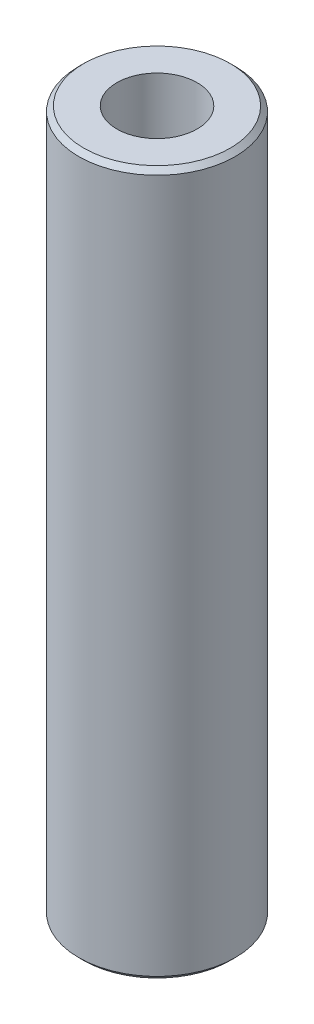
ISO-10303-21;
HEADER;
FILE_DESCRIPTION(('STEP AP214'),'2;1');
FILE_NAME('part.step','',(''),(''),'','','');
FILE_SCHEMA(('AUTOMOTIVE_DESIGN { 1 0 10303 214 1 1 1 1 }'));
ENDSEC;
DATA;
#1=APPLICATION_CONTEXT('core data for automotive mechanical design processes');
#2=APPLICATION_PROTOCOL_DEFINITION('international standard','automotive_design',2000,#1);
#3=PRODUCT_CONTEXT('',#1,'mechanical');
#4=PRODUCT('Part','Part','',(#3));
#5=PRODUCT_RELATED_PRODUCT_CATEGORY('part','',(#4));
#6=PRODUCT_DEFINITION_FORMATION('','',#4);
#7=PRODUCT_DEFINITION_CONTEXT('part definition',#1,'design');
#8=PRODUCT_DEFINITION('design','',#6,#7);
#9=PRODUCT_DEFINITION_SHAPE('','',#8);
#10=(LENGTH_UNIT() NAMED_UNIT(*) SI_UNIT(.MILLI.,.METRE.));
#11=(NAMED_UNIT(*) PLANE_ANGLE_UNIT() SI_UNIT($,.RADIAN.));
#12=(NAMED_UNIT(*) SI_UNIT($,.STERADIAN.) SOLID_ANGLE_UNIT());
#13=UNCERTAINTY_MEASURE_WITH_UNIT(LENGTH_MEASURE(1.E-05),#10,'distance_accuracy_value','');
#14=(GEOMETRIC_REPRESENTATION_CONTEXT(3) GLOBAL_UNCERTAINTY_ASSIGNED_CONTEXT((#13)) GLOBAL_UNIT_ASSIGNED_CONTEXT((#10,
#11,#12)) REPRESENTATION_CONTEXT('',''));
#15=CARTESIAN_POINT('',(0.,0.,0.));
#16=DIRECTION('',(0.,0.,1.));
#17=DIRECTION('',(1.,0.,0.));
#18=AXIS2_PLACEMENT_3D('',#15,#16,#17);
#19=CARTESIAN_POINT('',(0.,28.575,0.));
#20=DIRECTION('',(0.,-1.,0.));
#21=DIRECTION('',(0.,0.,-1.));
#22=AXIS2_PLACEMENT_3D('',#19,#20,#21);
#23=CYLINDRICAL_SURFACE('',#22,6.35);
#24=CARTESIAN_POINT('',(0.,-28.178125,0.));
#25=DIRECTION('',(0.,1.,0.));
#26=DIRECTION('',(0.,0.,1.));
#27=AXIS2_PLACEMENT_3D('',#24,#25,#26);
#28=CIRCLE('',#27,6.35);
#29=CARTESIAN_POINT('',(0.,-28.178125,6.35));
#30=VERTEX_POINT('',#29);
#31=EDGE_CURVE('E49',#30,#30,#28,.T.);
#32=ORIENTED_EDGE('',*,*,#31,.T.);
#33=EDGE_LOOP('',(#32));
#34=FACE_BOUND('',#33,.T.);
#35=CARTESIAN_POINT('',(0.,28.178125,0.));
#36=DIRECTION('',(0.,1.,0.));
#37=DIRECTION('',(0.,0.,1.));
#38=AXIS2_PLACEMENT_3D('',#35,#36,#37);
#39=CIRCLE('',#38,6.35);
#40=CARTESIAN_POINT('',(0.,28.178125,6.35));
#41=VERTEX_POINT('',#40);
#42=EDGE_CURVE('E53',#41,#41,#39,.F.);
#43=ORIENTED_EDGE('',*,*,#42,.T.);
#44=EDGE_LOOP('',(#43));
#45=FACE_BOUND('',#44,.T.);
#46=ADVANCED_FACE('F37',(#34,#45),#23,.T.);
#47=CARTESIAN_POINT('',(0.,28.575,0.));
#48=DIRECTION('',(0.,1.,0.));
#49=DIRECTION('',(0.,0.,1.));
#50=AXIS2_PLACEMENT_3D('',#47,#48,#49);
#51=PLANE('',#50);
#52=CARTESIAN_POINT('',(0.,28.575,0.));
#53=DIRECTION('',(0.,1.,0.));
#54=DIRECTION('',(0.,0.,1.));
#55=AXIS2_PLACEMENT_3D('',#52,#53,#54);
#56=CIRCLE('',#55,3.2639);
#57=CARTESIAN_POINT('',(0.,28.575,3.2639));
#58=VERTEX_POINT('',#57);
#59=EDGE_CURVE('E61',#58,#58,#56,.T.);
#60=ORIENTED_EDGE('',*,*,#59,.F.);
#61=EDGE_LOOP('',(#60));
#62=FACE_BOUND('',#61,.T.);
#63=CARTESIAN_POINT('',(0.,28.575,0.));
#64=DIRECTION('',(0.,1.,0.));
#65=DIRECTION('',(0.,0.,1.));
#66=AXIS2_PLACEMENT_3D('',#63,#64,#65);
#67=CIRCLE('',#66,5.953125);
#68=CARTESIAN_POINT('',(0.,28.575,5.953125));
#69=VERTEX_POINT('',#68);
#70=EDGE_CURVE('E10',#69,#69,#67,.T.);
#71=ORIENTED_EDGE('',*,*,#70,.T.);
#72=EDGE_LOOP('',(#71));
#73=FACE_BOUND('',#72,.T.);
#74=ADVANCED_FACE('F67',(#62,#73),#51,.T.);
#75=CARTESIAN_POINT('',(0.,-28.575,0.));
#76=DIRECTION('',(0.,1.,0.));
#77=DIRECTION('',(0.,0.,1.));
#78=AXIS2_PLACEMENT_3D('',#75,#76,#77);
#79=PLANE('',#78);
#80=CARTESIAN_POINT('',(0.,-28.575,0.));
#81=DIRECTION('',(0.,1.,0.));
#82=DIRECTION('',(0.,0.,1.));
#83=AXIS2_PLACEMENT_3D('',#80,#81,#82);
#84=CIRCLE('',#83,3.2639);
#85=CARTESIAN_POINT('',(0.,-28.575,3.2639));
#86=VERTEX_POINT('',#85);
#87=EDGE_CURVE('E58',#86,#86,#84,.T.);
#88=ORIENTED_EDGE('',*,*,#87,.T.);
#89=EDGE_LOOP('',(#88));
#90=FACE_BOUND('',#89,.T.);
#91=CARTESIAN_POINT('',(0.,-28.575,0.));
#92=DIRECTION('',(0.,1.,0.));
#93=DIRECTION('',(0.,0.,1.));
#94=AXIS2_PLACEMENT_3D('',#91,#92,#93);
#95=CIRCLE('',#94,5.953125);
#96=CARTESIAN_POINT('',(0.,-28.575,5.953125));
#97=VERTEX_POINT('',#96);
#98=EDGE_CURVE('E45',#97,#97,#95,.F.);
#99=ORIENTED_EDGE('',*,*,#98,.T.);
#100=EDGE_LOOP('',(#99));
#101=FACE_BOUND('',#100,.T.);
#102=ADVANCED_FACE('F69',(#90,#101),#79,.F.);
#103=CARTESIAN_POINT('',(0.,-28.178125,0.));
#104=DIRECTION('',(0.,1.,0.));
#105=DIRECTION('',(0.,0.,1.));
#106=AXIS2_PLACEMENT_3D('',#103,#104,#105);
#107=CONICAL_SURFACE('',#106,6.35,0.785398163397446);
#108=ORIENTED_EDGE('',*,*,#98,.F.);
#109=EDGE_LOOP('',(#108));
#110=FACE_BOUND('',#109,.T.);
#111=ORIENTED_EDGE('',*,*,#31,.F.);
#112=EDGE_LOOP('',(#111));
#113=FACE_BOUND('',#112,.T.);
#114=ADVANCED_FACE('F75',(#110,#113),#107,.T.);
#115=CARTESIAN_POINT('',(0.,28.575,0.));
#116=DIRECTION('',(0.,-1.,0.));
#117=DIRECTION('',(0.,0.,-1.));
#118=AXIS2_PLACEMENT_3D('',#115,#116,#117);
#119=CONICAL_SURFACE('',#118,5.953125,0.78539816339745);
#120=ORIENTED_EDGE('',*,*,#42,.F.);
#121=EDGE_LOOP('',(#120));
#122=FACE_BOUND('',#121,.T.);
#123=ORIENTED_EDGE('',*,*,#70,.F.);
#124=EDGE_LOOP('',(#123));
#125=FACE_BOUND('',#124,.T.);
#126=ADVANCED_FACE('F40',(#122,#125),#119,.T.);
#127=CARTESIAN_POINT('',(0.,-28.575,0.));
#128=DIRECTION('',(0.,1.,0.));
#129=DIRECTION('',(0.,0.,1.));
#130=AXIS2_PLACEMENT_3D('',#127,#128,#129);
#131=CYLINDRICAL_SURFACE('',#130,3.2639);
#132=ORIENTED_EDGE('',*,*,#87,.F.);
#133=EDGE_LOOP('',(#132));
#134=FACE_BOUND('',#133,.T.);
#135=ORIENTED_EDGE('',*,*,#59,.T.);
#136=EDGE_LOOP('',(#135));
#137=FACE_BOUND('',#136,.T.);
#138=ADVANCED_FACE('F65',(#134,#137),#131,.F.);
#139=CLOSED_SHELL('',(#46,#74,#102,#114,#126,#138));
#140=MANIFOLD_SOLID_BREP('B2',#139);
#141=ADVANCED_BREP_SHAPE_REPRESENTATION('',(#18,#140),#14);
#142=SHAPE_DEFINITION_REPRESENTATION(#9,#141);
ENDSEC;
END-ISO-10303-21;
